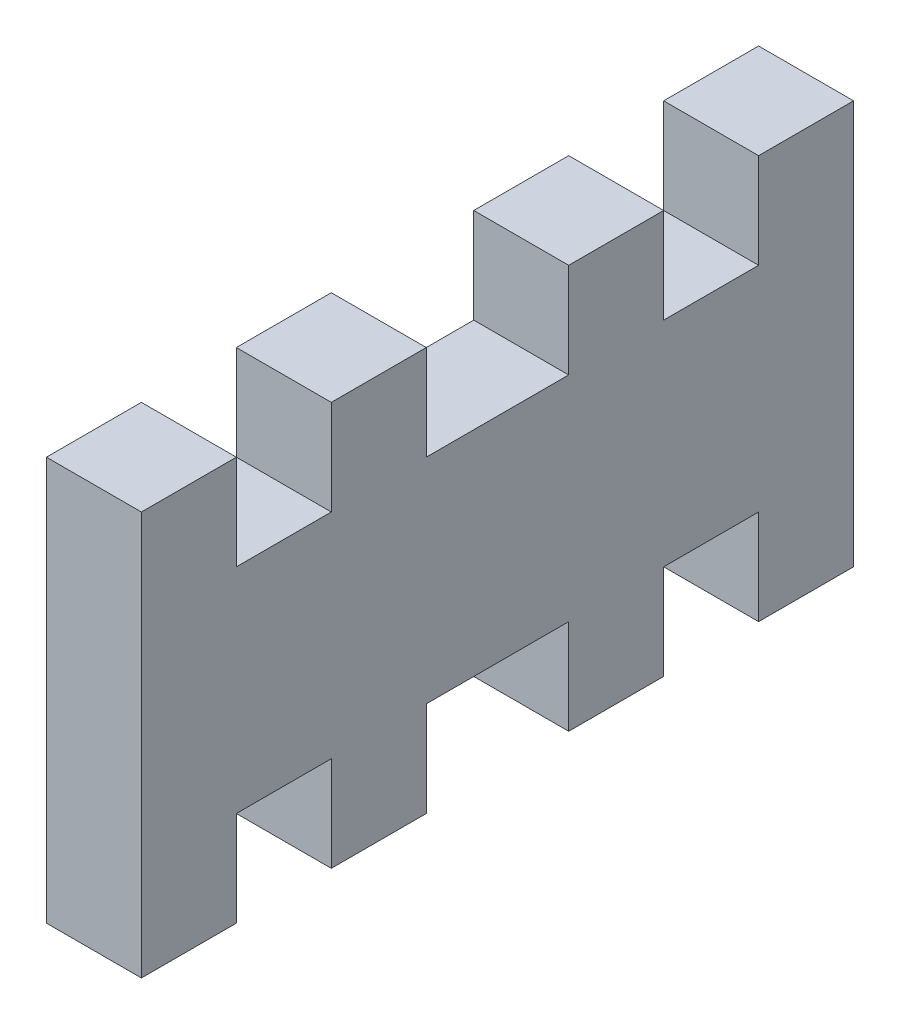
ISO-10303-21;
HEADER;
FILE_DESCRIPTION(('STEP AP214'),'2;1');
FILE_NAME('part.step','',(''),(''),'','','');
FILE_SCHEMA(('AUTOMOTIVE_DESIGN { 1 0 10303 214 1 1 1 1 }'));
ENDSEC;
DATA;
#1=APPLICATION_CONTEXT('core data for automotive mechanical design processes');
#2=APPLICATION_PROTOCOL_DEFINITION('international standard','automotive_design',2000,#1);
#3=PRODUCT_CONTEXT('',#1,'mechanical');
#4=PRODUCT('Part','Part','',(#3));
#5=PRODUCT_RELATED_PRODUCT_CATEGORY('part','',(#4));
#6=PRODUCT_DEFINITION_FORMATION('','',#4);
#7=PRODUCT_DEFINITION_CONTEXT('part definition',#1,'design');
#8=PRODUCT_DEFINITION('design','',#6,#7);
#9=PRODUCT_DEFINITION_SHAPE('','',#8);
#10=(LENGTH_UNIT() NAMED_UNIT(*) SI_UNIT(.MILLI.,.METRE.));
#11=(NAMED_UNIT(*) PLANE_ANGLE_UNIT() SI_UNIT($,.RADIAN.));
#12=(NAMED_UNIT(*) SI_UNIT($,.STERADIAN.) SOLID_ANGLE_UNIT());
#13=UNCERTAINTY_MEASURE_WITH_UNIT(LENGTH_MEASURE(1.E-05),#10,'distance_accuracy_value','');
#14=(GEOMETRIC_REPRESENTATION_CONTEXT(3) GLOBAL_UNCERTAINTY_ASSIGNED_CONTEXT((#13)) GLOBAL_UNIT_ASSIGNED_CONTEXT((#10,
#11,#12)) REPRESENTATION_CONTEXT('',''));
#15=CARTESIAN_POINT('',(0.,0.,0.));
#16=DIRECTION('',(0.,0.,1.));
#17=DIRECTION('',(1.,0.,0.));
#18=AXIS2_PLACEMENT_3D('',#15,#16,#17);
#19=CARTESIAN_POINT('',(5.08,4.2952358490566,13.6584905660377));
#20=DIRECTION('',(0.,1.,0.));
#21=DIRECTION('',(0.,0.,1.));
#22=AXIS2_PLACEMENT_3D('',#19,#20,#21);
#23=PLANE('',#22);
#24=DIRECTION('',(0.,0.,-1.));
#25=VECTOR('',#24,1.);
#26=CARTESIAN_POINT('',(5.08,4.2952358490566,13.6584905660377));
#27=LINE('',#26,#25);
#28=CARTESIAN_POINT('',(5.08,4.2952358490566,-14.2815094339623));
#29=VERTEX_POINT('',#28);
#30=CARTESIAN_POINT('',(5.08,4.2952358490566,-19.3615094339622));
#31=VERTEX_POINT('',#30);
#32=EDGE_CURVE('E37',#29,#31,#27,.T.);
#33=ORIENTED_EDGE('',*,*,#32,.F.);
#34=DIRECTION('',(1.,0.,0.));
#35=VECTOR('',#34,1.);
#36=CARTESIAN_POINT('',(0.,4.29523584905661,-14.2815094339623));
#37=LINE('',#36,#35);
#38=CARTESIAN_POINT('',(0.,4.29523584905661,-14.2815094339623));
#39=VERTEX_POINT('',#38);
#40=EDGE_CURVE('E252',#39,#29,#37,.T.);
#41=ORIENTED_EDGE('',*,*,#40,.F.);
#42=DIRECTION('',(0.,0.,-1.));
#43=VECTOR('',#42,1.);
#44=CARTESIAN_POINT('',(0.,4.2952358490566,13.6584905660377));
#45=LINE('',#44,#43);
#46=CARTESIAN_POINT('',(0.,4.2952358490566,-19.3615094339622));
#47=VERTEX_POINT('',#46);
#48=EDGE_CURVE('E351',#39,#47,#45,.T.);
#49=ORIENTED_EDGE('',*,*,#48,.T.);
#50=DIRECTION('',(1.,0.,0.));
#51=VECTOR('',#50,1.);
#52=CARTESIAN_POINT('',(0.,4.29523584905661,-19.3615094339622));
#53=LINE('',#52,#51);
#54=EDGE_CURVE('E264',#47,#31,#53,.T.);
#55=ORIENTED_EDGE('',*,*,#54,.T.);
#56=EDGE_LOOP('',(#33,#41,#49,#55));
#57=FACE_BOUND('',#56,.T.);
#58=ADVANCED_FACE('F33',(#57),#23,.F.);
#59=CARTESIAN_POINT('',(0.,4.29523584905661,-1.58150943396227));
#60=VERTEX_POINT('',#59);
#61=CARTESIAN_POINT('',(0.,4.2952358490566,-9.20150943396225));
#62=VERTEX_POINT('',#61);
#63=EDGE_CURVE('E338',#60,#62,#45,.T.);
#64=ORIENTED_EDGE('',*,*,#63,.T.);
#65=DIRECTION('',(1.,0.,0.));
#66=VECTOR('',#65,1.);
#67=CARTESIAN_POINT('',(0.,4.29523584905661,-9.20150943396226));
#68=LINE('',#67,#66);
#69=CARTESIAN_POINT('',(5.08,4.2952358490566,-9.20150943396225));
#70=VERTEX_POINT('',#69);
#71=EDGE_CURVE('E58',#62,#70,#68,.T.);
#72=ORIENTED_EDGE('',*,*,#71,.T.);
#73=CARTESIAN_POINT('',(5.08,4.29523584905661,-1.58150943396227));
#74=VERTEX_POINT('',#73);
#75=EDGE_CURVE('E540',#74,#70,#27,.T.);
#76=ORIENTED_EDGE('',*,*,#75,.F.);
#77=DIRECTION('',(1.,0.,0.));
#78=VECTOR('',#77,1.);
#79=CARTESIAN_POINT('',(0.,4.29523584905661,-1.58150943396227));
#80=LINE('',#79,#78);
#81=EDGE_CURVE('E299',#60,#74,#80,.T.);
#82=ORIENTED_EDGE('',*,*,#81,.F.);
#83=EDGE_LOOP('',(#64,#72,#76,#82));
#84=FACE_BOUND('',#83,.T.);
#85=ADVANCED_FACE('F520',(#84),#23,.F.);
#86=CARTESIAN_POINT('',(5.08,15.7252358490566,13.6584905660377));
#87=DIRECTION('',(0.,-1.,0.));
#88=DIRECTION('',(0.,0.,-1.));
#89=AXIS2_PLACEMENT_3D('',#86,#87,#88);
#90=PLANE('',#89);
#91=DIRECTION('',(0.,0.,1.));
#92=VECTOR('',#91,1.);
#93=CARTESIAN_POINT('',(5.08,15.7252358490566,13.6584905660377));
#94=LINE('',#93,#92);
#95=CARTESIAN_POINT('',(5.08,15.7252358490566,3.49849056603773));
#96=VERTEX_POINT('',#95);
#97=CARTESIAN_POINT('',(5.08,15.7252358490566,8.57849056603773));
#98=VERTEX_POINT('',#97);
#99=EDGE_CURVE('E408',#96,#98,#94,.T.);
#100=ORIENTED_EDGE('',*,*,#99,.F.);
#101=DIRECTION('',(1.,0.,0.));
#102=VECTOR('',#101,1.);
#103=CARTESIAN_POINT('',(0.,15.7252358490566,3.49849056603773));
#104=LINE('',#103,#102);
#105=CARTESIAN_POINT('',(0.,15.7252358490566,3.49849056603773));
#106=VERTEX_POINT('',#105);
#107=EDGE_CURVE('E465',#106,#96,#104,.T.);
#108=ORIENTED_EDGE('',*,*,#107,.F.);
#109=DIRECTION('',(0.,0.,1.));
#110=VECTOR('',#109,1.);
#111=CARTESIAN_POINT('',(0.,15.7252358490566,13.6584905660377));
#112=LINE('',#111,#110);
#113=CARTESIAN_POINT('',(0.,15.7252358490566,8.57849056603773));
#114=VERTEX_POINT('',#113);
#115=EDGE_CURVE('E407',#106,#114,#112,.T.);
#116=ORIENTED_EDGE('',*,*,#115,.T.);
#117=DIRECTION('',(1.,0.,0.));
#118=VECTOR('',#117,1.);
#119=CARTESIAN_POINT('',(0.,15.7252358490566,8.57849056603773));
#120=LINE('',#119,#118);
#121=EDGE_CURVE('E450',#114,#98,#120,.T.);
#122=ORIENTED_EDGE('',*,*,#121,.T.);
#123=EDGE_LOOP('',(#100,#108,#116,#122));
#124=FACE_BOUND('',#123,.T.);
#125=ADVANCED_FACE('F525',(#124),#90,.F.);
#126=CARTESIAN_POINT('',(0.,15.7252358490566,-9.20150943396227));
#127=VERTEX_POINT('',#126);
#128=CARTESIAN_POINT('',(0.,15.7252358490566,-1.58150943396227));
#129=VERTEX_POINT('',#128);
#130=EDGE_CURVE('E400',#127,#129,#112,.T.);
#131=ORIENTED_EDGE('',*,*,#130,.T.);
#132=DIRECTION('',(1.,0.,0.));
#133=VECTOR('',#132,1.);
#134=CARTESIAN_POINT('',(0.,15.7252358490566,-1.58150943396227));
#135=LINE('',#134,#133);
#136=CARTESIAN_POINT('',(5.08,15.7252358490566,-1.58150943396227));
#137=VERTEX_POINT('',#136);
#138=EDGE_CURVE('E470',#129,#137,#135,.T.);
#139=ORIENTED_EDGE('',*,*,#138,.T.);
#140=CARTESIAN_POINT('',(5.08,15.7252358490566,-9.20150943396227));
#141=VERTEX_POINT('',#140);
#142=EDGE_CURVE('E43',#141,#137,#94,.T.);
#143=ORIENTED_EDGE('',*,*,#142,.F.);
#144=DIRECTION('',(1.,0.,0.));
#145=VECTOR('',#144,1.);
#146=CARTESIAN_POINT('',(0.,15.7252358490566,-9.20150943396227));
#147=LINE('',#146,#145);
#148=EDGE_CURVE('E377',#127,#141,#147,.T.);
#149=ORIENTED_EDGE('',*,*,#148,.F.);
#150=EDGE_LOOP('',(#131,#139,#143,#149));
#151=FACE_BOUND('',#150,.T.);
#152=ADVANCED_FACE('F506',(#151),#90,.F.);
#153=CARTESIAN_POINT('',(5.08,15.7252358490566,13.6584905660377));
#154=DIRECTION('',(0.,0.,-1.));
#155=DIRECTION('',(0.,1.,0.));
#156=AXIS2_PLACEMENT_3D('',#153,#154,#155);
#157=PLANE('',#156);
#158=DIRECTION('',(0.,-1.,0.));
#159=VECTOR('',#158,1.);
#160=CARTESIAN_POINT('',(0.,15.7252358490566,13.6584905660377));
#161=LINE('',#160,#159);
#162=CARTESIAN_POINT('',(0.,20.8052358490566,13.6584905660377));
#163=VERTEX_POINT('',#162);
#164=CARTESIAN_POINT('',(0.,-0.784764150943393,13.6584905660377));
#165=VERTEX_POINT('',#164);
#166=EDGE_CURVE('E343',#163,#165,#161,.T.);
#167=ORIENTED_EDGE('',*,*,#166,.T.);
#168=DIRECTION('',(1.,0.,0.));
#169=VECTOR('',#168,1.);
#170=CARTESIAN_POINT('',(0.,-0.784764150943393,13.6584905660377));
#171=LINE('',#170,#169);
#172=CARTESIAN_POINT('',(5.08,-0.784764150943393,13.6584905660377));
#173=VERTEX_POINT('',#172);
#174=EDGE_CURVE('E291',#165,#173,#171,.T.);
#175=ORIENTED_EDGE('',*,*,#174,.T.);
#176=DIRECTION('',(0.,-1.,0.));
#177=VECTOR('',#176,1.);
#178=CARTESIAN_POINT('',(5.08,15.7252358490566,13.6584905660377));
#179=LINE('',#178,#177);
#180=CARTESIAN_POINT('',(5.08,20.8052358490566,13.6584905660377));
#181=VERTEX_POINT('',#180);
#182=EDGE_CURVE('E399',#181,#173,#179,.T.);
#183=ORIENTED_EDGE('',*,*,#182,.F.);
#184=DIRECTION('',(1.,0.,0.));
#185=VECTOR('',#184,1.);
#186=CARTESIAN_POINT('',(0.,20.8052358490566,13.6584905660377));
#187=LINE('',#186,#185);
#188=EDGE_CURVE('E445',#163,#181,#187,.T.);
#189=ORIENTED_EDGE('',*,*,#188,.F.);
#190=EDGE_LOOP('',(#167,#175,#183,#189));
#191=FACE_BOUND('',#190,.T.);
#192=ADVANCED_FACE('F35',(#191),#157,.F.);
#193=CARTESIAN_POINT('',(5.08,4.2952358490566,8.57849056603773));
#194=VERTEX_POINT('',#193);
#195=CARTESIAN_POINT('',(5.08,4.2952358490566,3.49849056603774));
#196=VERTEX_POINT('',#195);
#197=EDGE_CURVE('E339',#194,#196,#27,.T.);
#198=ORIENTED_EDGE('',*,*,#197,.F.);
#199=DIRECTION('',(1.,0.,0.));
#200=VECTOR('',#199,1.);
#201=CARTESIAN_POINT('',(0.,4.29523584905661,8.57849056603773));
#202=LINE('',#201,#200);
#203=CARTESIAN_POINT('',(0.,4.29523584905661,8.57849056603773));
#204=VERTEX_POINT('',#203);
#205=EDGE_CURVE('E283',#204,#194,#202,.T.);
#206=ORIENTED_EDGE('',*,*,#205,.F.);
#207=CARTESIAN_POINT('',(0.,4.29523584905661,3.49849056603773));
#208=VERTEX_POINT('',#207);
#209=EDGE_CURVE('E334',#204,#208,#45,.T.);
#210=ORIENTED_EDGE('',*,*,#209,.T.);
#211=DIRECTION('',(1.,0.,0.));
#212=VECTOR('',#211,1.);
#213=CARTESIAN_POINT('',(0.,4.29523584905661,3.49849056603773));
#214=LINE('',#213,#212);
#215=EDGE_CURVE('E311',#208,#196,#214,.T.);
#216=ORIENTED_EDGE('',*,*,#215,.T.);
#217=EDGE_LOOP('',(#198,#206,#210,#216));
#218=FACE_BOUND('',#217,.T.);
#219=ADVANCED_FACE('F521',(#218),#23,.F.);
#220=CARTESIAN_POINT('',(5.08,15.7252358490566,-24.4415094339623));
#221=DIRECTION('',(0.,0.,1.));
#222=DIRECTION('',(1.,0.,0.));
#223=AXIS2_PLACEMENT_3D('',#220,#221,#222);
#224=PLANE('',#223);
#225=DIRECTION('',(0.,1.,0.));
#226=VECTOR('',#225,1.);
#227=CARTESIAN_POINT('',(0.,15.7252358490566,-24.4415094339623));
#228=LINE('',#227,#226);
#229=CARTESIAN_POINT('',(0.,-0.784764150943393,-24.4415094339622));
#230=VERTEX_POINT('',#229);
#231=CARTESIAN_POINT('',(0.,20.8052358490566,-24.4415094339623));
#232=VERTEX_POINT('',#231);
#233=EDGE_CURVE('E337',#230,#232,#228,.T.);
#234=ORIENTED_EDGE('',*,*,#233,.T.);
#235=DIRECTION('',(1.,0.,0.));
#236=VECTOR('',#235,1.);
#237=CARTESIAN_POINT('',(0.,20.8052358490566,-24.4415094339623));
#238=LINE('',#237,#236);
#239=CARTESIAN_POINT('',(5.08,20.8052358490566,-24.4415094339623));
#240=VERTEX_POINT('',#239);
#241=EDGE_CURVE('E433',#232,#240,#238,.T.);
#242=ORIENTED_EDGE('',*,*,#241,.T.);
#243=DIRECTION('',(0.,1.,0.));
#244=VECTOR('',#243,1.);
#245=CARTESIAN_POINT('',(5.08,15.7252358490566,-24.4415094339623));
#246=LINE('',#245,#244);
#247=CARTESIAN_POINT('',(5.08,-0.784764150943393,-24.4415094339622));
#248=VERTEX_POINT('',#247);
#249=EDGE_CURVE('E409',#248,#240,#246,.T.);
#250=ORIENTED_EDGE('',*,*,#249,.F.);
#251=DIRECTION('',(1.,0.,0.));
#252=VECTOR('',#251,1.);
#253=CARTESIAN_POINT('',(0.,-0.784764150943393,-24.4415094339622));
#254=LINE('',#253,#252);
#255=EDGE_CURVE('E269',#230,#248,#254,.T.);
#256=ORIENTED_EDGE('',*,*,#255,.F.);
#257=EDGE_LOOP('',(#234,#242,#250,#256));
#258=FACE_BOUND('',#257,.T.);
#259=ADVANCED_FACE('F528',(#258),#224,.F.);
#260=CARTESIAN_POINT('',(5.08,15.7252358490566,-19.3615094339623));
#261=VERTEX_POINT('',#260);
#262=CARTESIAN_POINT('',(5.08,15.7252358490566,-14.2815094339623));
#263=VERTEX_POINT('',#262);
#264=EDGE_CURVE('E11',#261,#263,#94,.T.);
#265=ORIENTED_EDGE('',*,*,#264,.F.);
#266=DIRECTION('',(1.,0.,0.));
#267=VECTOR('',#266,1.);
#268=CARTESIAN_POINT('',(0.,15.7252358490566,-19.3615094339623));
#269=LINE('',#268,#267);
#270=CARTESIAN_POINT('',(0.,15.7252358490566,-19.3615094339623));
#271=VERTEX_POINT('',#270);
#272=EDGE_CURVE('E430',#271,#261,#269,.T.);
#273=ORIENTED_EDGE('',*,*,#272,.F.);
#274=CARTESIAN_POINT('',(0.,15.7252358490566,-14.2815094339623));
#275=VERTEX_POINT('',#274);
#276=EDGE_CURVE('E398',#271,#275,#112,.T.);
#277=ORIENTED_EDGE('',*,*,#276,.T.);
#278=DIRECTION('',(1.,0.,0.));
#279=VECTOR('',#278,1.);
#280=CARTESIAN_POINT('',(0.,15.7252358490566,-14.2815094339623));
#281=LINE('',#280,#279);
#282=EDGE_CURVE('E363',#275,#263,#281,.T.);
#283=ORIENTED_EDGE('',*,*,#282,.T.);
#284=EDGE_LOOP('',(#265,#273,#277,#283));
#285=FACE_BOUND('',#284,.T.);
#286=ADVANCED_FACE('F534',(#285),#90,.F.);
#287=CARTESIAN_POINT('',(5.08,0.,0.));
#288=DIRECTION('',(1.,0.,0.));
#289=DIRECTION('',(0.,0.,-1.));
#290=AXIS2_PLACEMENT_3D('',#287,#288,#289);
#291=PLANE('',#290);
#292=ORIENTED_EDGE('',*,*,#182,.T.);
#293=DIRECTION('',(0.,0.,-1.));
#294=VECTOR('',#293,1.);
#295=CARTESIAN_POINT('',(5.08,-0.784764150943393,8.57849056603773));
#296=LINE('',#295,#294);
#297=CARTESIAN_POINT('',(5.08,-0.784764150943393,8.57849056603773));
#298=VERTEX_POINT('',#297);
#299=EDGE_CURVE('E280',#173,#298,#296,.T.);
#300=ORIENTED_EDGE('',*,*,#299,.T.);
#301=DIRECTION('',(0.,1.,0.));
#302=VECTOR('',#301,1.);
#303=CARTESIAN_POINT('',(5.08,4.29523584905661,8.57849056603773));
#304=LINE('',#303,#302);
#305=EDGE_CURVE('E272',#298,#194,#304,.T.);
#306=ORIENTED_EDGE('',*,*,#305,.T.);
#307=ORIENTED_EDGE('',*,*,#197,.T.);
#308=DIRECTION('',(0.,-1.,0.));
#309=VECTOR('',#308,1.);
#310=CARTESIAN_POINT('',(5.08,4.29523584905661,3.49849056603773));
#311=LINE('',#310,#309);
#312=CARTESIAN_POINT('',(5.08,-0.784764150943393,3.49849056603773));
#313=VERTEX_POINT('',#312);
#314=EDGE_CURVE('E305',#196,#313,#311,.T.);
#315=ORIENTED_EDGE('',*,*,#314,.T.);
#316=DIRECTION('',(0.,0.,-1.));
#317=VECTOR('',#316,1.);
#318=CARTESIAN_POINT('',(5.08,-0.784764150943393,-1.58150943396227));
#319=LINE('',#318,#317);
#320=CARTESIAN_POINT('',(5.08,-0.784764150943393,-1.58150943396227));
#321=VERTEX_POINT('',#320);
#322=EDGE_CURVE('E301',#313,#321,#319,.T.);
#323=ORIENTED_EDGE('',*,*,#322,.T.);
#324=DIRECTION('',(0.,1.,0.));
#325=VECTOR('',#324,1.);
#326=CARTESIAN_POINT('',(5.08,4.29523584905661,-1.58150943396227));
#327=LINE('',#326,#325);
#328=EDGE_CURVE('E290',#321,#74,#327,.T.);
#329=ORIENTED_EDGE('',*,*,#328,.T.);
#330=ORIENTED_EDGE('',*,*,#75,.T.);
#331=DIRECTION('',(0.,-1.,0.));
#332=VECTOR('',#331,1.);
#333=CARTESIAN_POINT('',(5.08,4.29523584905661,-9.20150943396226));
#334=LINE('',#333,#332);
#335=CARTESIAN_POINT('',(5.08,-0.784764150943393,-9.20150943396226));
#336=VERTEX_POINT('',#335);
#337=EDGE_CURVE('E249',#70,#336,#334,.T.);
#338=ORIENTED_EDGE('',*,*,#337,.T.);
#339=DIRECTION('',(0.,0.,-1.));
#340=VECTOR('',#339,1.);
#341=CARTESIAN_POINT('',(5.08,-0.784764150943393,-9.20150943396226));
#342=LINE('',#341,#340);
#343=CARTESIAN_POINT('',(5.08,-0.784764150943393,-14.2815094339623));
#344=VERTEX_POINT('',#343);
#345=EDGE_CURVE('E227',#336,#344,#342,.T.);
#346=ORIENTED_EDGE('',*,*,#345,.T.);
#347=DIRECTION('',(0.,1.,0.));
#348=VECTOR('',#347,1.);
#349=CARTESIAN_POINT('',(5.08,4.29523584905661,-14.2815094339623));
#350=LINE('',#349,#348);
#351=EDGE_CURVE('E243',#344,#29,#350,.T.);
#352=ORIENTED_EDGE('',*,*,#351,.T.);
#353=ORIENTED_EDGE('',*,*,#32,.T.);
#354=DIRECTION('',(0.,-1.,0.));
#355=VECTOR('',#354,1.);
#356=CARTESIAN_POINT('',(5.08,4.29523584905661,-19.3615094339622));
#357=LINE('',#356,#355);
#358=CARTESIAN_POINT('',(5.08,-0.784764150943393,-19.3615094339622));
#359=VERTEX_POINT('',#358);
#360=EDGE_CURVE('E254',#31,#359,#357,.T.);
#361=ORIENTED_EDGE('',*,*,#360,.T.);
#362=DIRECTION('',(0.,0.,-1.));
#363=VECTOR('',#362,1.);
#364=CARTESIAN_POINT('',(5.08,-0.784764150943393,-19.3615094339622));
#365=LINE('',#364,#363);
#366=EDGE_CURVE('E261',#359,#248,#365,.T.);
#367=ORIENTED_EDGE('',*,*,#366,.T.);
#368=ORIENTED_EDGE('',*,*,#249,.T.);
#369=DIRECTION('',(0.,0.,1.));
#370=VECTOR('',#369,1.);
#371=CARTESIAN_POINT('',(5.08,20.8052358490566,-19.3615094339623));
#372=LINE('',#371,#370);
#373=CARTESIAN_POINT('',(5.08,20.8052358490566,-19.3615094339623));
#374=VERTEX_POINT('',#373);
#375=EDGE_CURVE('E438',#240,#374,#372,.T.);
#376=ORIENTED_EDGE('',*,*,#375,.T.);
#377=DIRECTION('',(0.,-1.,0.));
#378=VECTOR('',#377,1.);
#379=CARTESIAN_POINT('',(5.08,15.7252358490566,-19.3615094339623));
#380=LINE('',#379,#378);
#381=EDGE_CURVE('E442',#374,#261,#380,.T.);
#382=ORIENTED_EDGE('',*,*,#381,.T.);
#383=ORIENTED_EDGE('',*,*,#264,.T.);
#384=DIRECTION('',(0.,1.,0.));
#385=VECTOR('',#384,1.);
#386=CARTESIAN_POINT('',(5.08,15.7252358490566,-14.2815094339623));
#387=LINE('',#386,#385);
#388=CARTESIAN_POINT('',(5.08,20.8052358490566,-14.2815094339623));
#389=VERTEX_POINT('',#388);
#390=EDGE_CURVE('E394',#263,#389,#387,.T.);
#391=ORIENTED_EDGE('',*,*,#390,.T.);
#392=DIRECTION('',(0.,0.,1.));
#393=VECTOR('',#392,1.);
#394=CARTESIAN_POINT('',(5.08,20.8052358490566,-9.20150943396227));
#395=LINE('',#394,#393);
#396=CARTESIAN_POINT('',(5.08,20.8052358490566,-9.20150943396227));
#397=VERTEX_POINT('',#396);
#398=EDGE_CURVE('E366',#389,#397,#395,.T.);
#399=ORIENTED_EDGE('',*,*,#398,.T.);
#400=DIRECTION('',(0.,-1.,0.));
#401=VECTOR('',#400,1.);
#402=CARTESIAN_POINT('',(5.08,15.7252358490566,-9.20150943396227));
#403=LINE('',#402,#401);
#404=EDGE_CURVE('E391',#397,#141,#403,.T.);
#405=ORIENTED_EDGE('',*,*,#404,.T.);
#406=ORIENTED_EDGE('',*,*,#142,.T.);
#407=DIRECTION('',(0.,1.,0.));
#408=VECTOR('',#407,1.);
#409=CARTESIAN_POINT('',(5.08,15.7252358490566,-1.58150943396227));
#410=LINE('',#409,#408);
#411=CARTESIAN_POINT('',(5.08,20.8052358490566,-1.58150943396227));
#412=VERTEX_POINT('',#411);
#413=EDGE_CURVE('E308',#137,#412,#410,.T.);
#414=ORIENTED_EDGE('',*,*,#413,.T.);
#415=DIRECTION('',(0.,0.,1.));
#416=VECTOR('',#415,1.);
#417=CARTESIAN_POINT('',(5.08,20.8052358490566,-1.58150943396227));
#418=LINE('',#417,#416);
#419=CARTESIAN_POINT('',(5.08,20.8052358490566,3.49849056603773));
#420=VERTEX_POINT('',#419);
#421=EDGE_CURVE('E483',#412,#420,#418,.T.);
#422=ORIENTED_EDGE('',*,*,#421,.T.);
#423=DIRECTION('',(0.,-1.,0.));
#424=VECTOR('',#423,1.);
#425=CARTESIAN_POINT('',(5.08,15.7252358490566,3.49849056603773));
#426=LINE('',#425,#424);
#427=EDGE_CURVE('E479',#420,#96,#426,.T.);
#428=ORIENTED_EDGE('',*,*,#427,.T.);
#429=ORIENTED_EDGE('',*,*,#99,.T.);
#430=DIRECTION('',(0.,1.,0.));
#431=VECTOR('',#430,1.);
#432=CARTESIAN_POINT('',(5.08,15.7252358490566,8.57849056603773));
#433=LINE('',#432,#431);
#434=CARTESIAN_POINT('',(5.08,20.8052358490566,8.57849056603773));
#435=VERTEX_POINT('',#434);
#436=EDGE_CURVE('E462',#98,#435,#433,.T.);
#437=ORIENTED_EDGE('',*,*,#436,.T.);
#438=DIRECTION('',(0.,0.,1.));
#439=VECTOR('',#438,1.);
#440=CARTESIAN_POINT('',(5.08,20.8052358490566,8.57849056603773));
#441=LINE('',#440,#439);
#442=EDGE_CURVE('E458',#435,#181,#441,.T.);
#443=ORIENTED_EDGE('',*,*,#442,.T.);
#444=EDGE_LOOP('',(#292,#300,#306,#307,#315,#323,#329,#330,#338,#346,#352,#353,#361,#367,#368,
#376,#382,#383,#391,#399,#405,#406,#414,#422,#428,#429,#437,#443));
#445=FACE_BOUND('',#444,.T.);
#446=ADVANCED_FACE('F419',(#445),#291,.T.);
#447=CARTESIAN_POINT('',(0.,0.,0.));
#448=DIRECTION('',(1.,0.,0.));
#449=DIRECTION('',(0.,0.,-1.));
#450=AXIS2_PLACEMENT_3D('',#447,#448,#449);
#451=PLANE('',#450);
#452=ORIENTED_EDGE('',*,*,#166,.F.);
#453=DIRECTION('',(0.,0.,1.));
#454=VECTOR('',#453,1.);
#455=CARTESIAN_POINT('',(0.,20.8052358490566,8.57849056603773));
#456=LINE('',#455,#454);
#457=CARTESIAN_POINT('',(0.,20.8052358490566,8.57849056603773));
#458=VERTEX_POINT('',#457);
#459=EDGE_CURVE('E454',#458,#163,#456,.T.);
#460=ORIENTED_EDGE('',*,*,#459,.F.);
#461=DIRECTION('',(0.,1.,0.));
#462=VECTOR('',#461,1.);
#463=CARTESIAN_POINT('',(0.,15.7252358490566,8.57849056603773));
#464=LINE('',#463,#462);
#465=EDGE_CURVE('E461',#114,#458,#464,.T.);
#466=ORIENTED_EDGE('',*,*,#465,.F.);
#467=ORIENTED_EDGE('',*,*,#115,.F.);
#468=DIRECTION('',(0.,-1.,0.));
#469=VECTOR('',#468,1.);
#470=CARTESIAN_POINT('',(0.,15.7252358490566,3.49849056603773));
#471=LINE('',#470,#469);
#472=CARTESIAN_POINT('',(0.,20.8052358490566,3.49849056603773));
#473=VERTEX_POINT('',#472);
#474=EDGE_CURVE('E473',#473,#106,#471,.T.);
#475=ORIENTED_EDGE('',*,*,#474,.F.);
#476=DIRECTION('',(0.,0.,1.));
#477=VECTOR('',#476,1.);
#478=CARTESIAN_POINT('',(0.,20.8052358490566,-1.58150943396227));
#479=LINE('',#478,#477);
#480=CARTESIAN_POINT('',(0.,20.8052358490566,-1.58150943396227));
#481=VERTEX_POINT('',#480);
#482=EDGE_CURVE('E490',#481,#473,#479,.T.);
#483=ORIENTED_EDGE('',*,*,#482,.F.);
#484=DIRECTION('',(0.,1.,0.));
#485=VECTOR('',#484,1.);
#486=CARTESIAN_POINT('',(0.,15.7252358490566,-1.58150943396227));
#487=LINE('',#486,#485);
#488=EDGE_CURVE('E482',#129,#481,#487,.T.);
#489=ORIENTED_EDGE('',*,*,#488,.F.);
#490=ORIENTED_EDGE('',*,*,#130,.F.);
#491=DIRECTION('',(0.,-1.,0.));
#492=VECTOR('',#491,1.);
#493=CARTESIAN_POINT('',(0.,15.7252358490566,-9.20150943396227));
#494=LINE('',#493,#492);
#495=CARTESIAN_POINT('',(0.,20.8052358490566,-9.20150943396227));
#496=VERTEX_POINT('',#495);
#497=EDGE_CURVE('E384',#496,#127,#494,.T.);
#498=ORIENTED_EDGE('',*,*,#497,.F.);
#499=DIRECTION('',(0.,0.,1.));
#500=VECTOR('',#499,1.);
#501=CARTESIAN_POINT('',(0.,20.8052358490566,-9.20150943396227));
#502=LINE('',#501,#500);
#503=CARTESIAN_POINT('',(0.,20.8052358490566,-14.2815094339623));
#504=VERTEX_POINT('',#503);
#505=EDGE_CURVE('E383',#504,#496,#502,.T.);
#506=ORIENTED_EDGE('',*,*,#505,.F.);
#507=DIRECTION('',(0.,1.,0.));
#508=VECTOR('',#507,1.);
#509=CARTESIAN_POINT('',(0.,15.7252358490566,-14.2815094339623));
#510=LINE('',#509,#508);
#511=EDGE_CURVE('E380',#275,#504,#510,.T.);
#512=ORIENTED_EDGE('',*,*,#511,.F.);
#513=ORIENTED_EDGE('',*,*,#276,.F.);
#514=DIRECTION('',(0.,-1.,0.));
#515=VECTOR('',#514,1.);
#516=CARTESIAN_POINT('',(0.,15.7252358490566,-19.3615094339623));
#517=LINE('',#516,#515);
#518=CARTESIAN_POINT('',(0.,20.8052358490566,-19.3615094339623));
#519=VERTEX_POINT('',#518);
#520=EDGE_CURVE('E441',#519,#271,#517,.T.);
#521=ORIENTED_EDGE('',*,*,#520,.F.);
#522=DIRECTION('',(0.,0.,1.));
#523=VECTOR('',#522,1.);
#524=CARTESIAN_POINT('',(0.,20.8052358490566,-19.3615094339623));
#525=LINE('',#524,#523);
#526=EDGE_CURVE('E434',#232,#519,#525,.T.);
#527=ORIENTED_EDGE('',*,*,#526,.F.);
#528=ORIENTED_EDGE('',*,*,#233,.F.);
#529=DIRECTION('',(0.,0.,-1.));
#530=VECTOR('',#529,1.);
#531=CARTESIAN_POINT('',(0.,-0.784764150943393,-19.3615094339622));
#532=LINE('',#531,#530);
#533=CARTESIAN_POINT('',(0.,-0.784764150943393,-19.3615094339622));
#534=VERTEX_POINT('',#533);
#535=EDGE_CURVE('E260',#534,#230,#532,.T.);
#536=ORIENTED_EDGE('',*,*,#535,.F.);
#537=DIRECTION('',(0.,-1.,0.));
#538=VECTOR('',#537,1.);
#539=CARTESIAN_POINT('',(0.,4.29523584905661,-19.3615094339622));
#540=LINE('',#539,#538);
#541=EDGE_CURVE('E257',#47,#534,#540,.T.);
#542=ORIENTED_EDGE('',*,*,#541,.F.);
#543=ORIENTED_EDGE('',*,*,#48,.F.);
#544=DIRECTION('',(0.,1.,0.));
#545=VECTOR('',#544,1.);
#546=CARTESIAN_POINT('',(0.,4.29523584905661,-14.2815094339623));
#547=LINE('',#546,#545);
#548=CARTESIAN_POINT('',(0.,-0.784764150943393,-14.2815094339623));
#549=VERTEX_POINT('',#548);
#550=EDGE_CURVE('E240',#549,#39,#547,.T.);
#551=ORIENTED_EDGE('',*,*,#550,.F.);
#552=DIRECTION('',(0.,0.,-1.));
#553=VECTOR('',#552,1.);
#554=CARTESIAN_POINT('',(0.,-0.784764150943393,-9.20150943396226));
#555=LINE('',#554,#553);
#556=CARTESIAN_POINT('',(0.,-0.784764150943393,-9.20150943396226));
#557=VERTEX_POINT('',#556);
#558=EDGE_CURVE('E224',#557,#549,#555,.T.);
#559=ORIENTED_EDGE('',*,*,#558,.F.);
#560=DIRECTION('',(0.,-1.,0.));
#561=VECTOR('',#560,1.);
#562=CARTESIAN_POINT('',(0.,4.29523584905661,-9.20150943396226));
#563=LINE('',#562,#561);
#564=EDGE_CURVE('E238',#62,#557,#563,.T.);
#565=ORIENTED_EDGE('',*,*,#564,.F.);
#566=ORIENTED_EDGE('',*,*,#63,.F.);
#567=DIRECTION('',(0.,1.,0.));
#568=VECTOR('',#567,1.);
#569=CARTESIAN_POINT('',(0.,4.29523584905661,-1.58150943396227));
#570=LINE('',#569,#568);
#571=CARTESIAN_POINT('',(0.,-0.784764150943393,-1.58150943396227));
#572=VERTEX_POINT('',#571);
#573=EDGE_CURVE('E304',#572,#60,#570,.T.);
#574=ORIENTED_EDGE('',*,*,#573,.F.);
#575=DIRECTION('',(0.,0.,-1.));
#576=VECTOR('',#575,1.);
#577=CARTESIAN_POINT('',(0.,-0.784764150943393,-1.58150943396227));
#578=LINE('',#577,#576);
#579=CARTESIAN_POINT('',(0.,-0.784764150943393,3.49849056603773));
#580=VERTEX_POINT('',#579);
#581=EDGE_CURVE('E296',#580,#572,#578,.T.);
#582=ORIENTED_EDGE('',*,*,#581,.F.);
#583=DIRECTION('',(0.,-1.,0.));
#584=VECTOR('',#583,1.);
#585=CARTESIAN_POINT('',(0.,4.29523584905661,3.49849056603773));
#586=LINE('',#585,#584);
#587=EDGE_CURVE('E300',#208,#580,#586,.T.);
#588=ORIENTED_EDGE('',*,*,#587,.F.);
#589=ORIENTED_EDGE('',*,*,#209,.F.);
#590=DIRECTION('',(0.,1.,0.));
#591=VECTOR('',#590,1.);
#592=CARTESIAN_POINT('',(0.,4.29523584905661,8.57849056603773));
#593=LINE('',#592,#591);
#594=CARTESIAN_POINT('',(0.,-0.784764150943393,8.57849056603773));
#595=VERTEX_POINT('',#594);
#596=EDGE_CURVE('E276',#595,#204,#593,.T.);
#597=ORIENTED_EDGE('',*,*,#596,.F.);
#598=DIRECTION('',(0.,0.,-1.));
#599=VECTOR('',#598,1.);
#600=CARTESIAN_POINT('',(0.,-0.784764150943393,8.57849056603773));
#601=LINE('',#600,#599);
#602=EDGE_CURVE('E279',#165,#595,#601,.T.);
#603=ORIENTED_EDGE('',*,*,#602,.F.);
#604=EDGE_LOOP('',(#452,#460,#466,#467,#475,#483,#489,#490,#498,#506,#512,#513,#521,#527,#528,
#536,#542,#543,#551,#559,#565,#566,#574,#582,#588,#589,#597,#603));
#605=FACE_BOUND('',#604,.T.);
#606=ADVANCED_FACE('F236',(#605),#451,.F.);
#607=CARTESIAN_POINT('',(0.,15.7252358490566,-9.20150943396227));
#608=DIRECTION('',(0.,0.,1.));
#609=DIRECTION('',(1.,0.,0.));
#610=AXIS2_PLACEMENT_3D('',#607,#608,#609);
#611=PLANE('',#610);
#612=ORIENTED_EDGE('',*,*,#404,.F.);
#613=DIRECTION('',(1.,0.,0.));
#614=VECTOR('',#613,1.);
#615=CARTESIAN_POINT('',(0.,20.8052358490566,-9.20150943396227));
#616=LINE('',#615,#614);
#617=EDGE_CURVE('E353',#496,#397,#616,.T.);
#618=ORIENTED_EDGE('',*,*,#617,.F.);
#619=ORIENTED_EDGE('',*,*,#497,.T.);
#620=ORIENTED_EDGE('',*,*,#148,.T.);
#621=EDGE_LOOP('',(#612,#618,#619,#620));
#622=FACE_BOUND('',#621,.T.);
#623=ADVANCED_FACE('F508',(#622),#611,.T.);
#624=CARTESIAN_POINT('',(0.,20.8052358490566,-9.20150943396227));
#625=DIRECTION('',(0.,1.,0.));
#626=DIRECTION('',(0.,0.,1.));
#627=AXIS2_PLACEMENT_3D('',#624,#625,#626);
#628=PLANE('',#627);
#629=ORIENTED_EDGE('',*,*,#398,.F.);
#630=DIRECTION('',(1.,0.,0.));
#631=VECTOR('',#630,1.);
#632=CARTESIAN_POINT('',(0.,20.8052358490566,-14.2815094339623));
#633=LINE('',#632,#631);
#634=EDGE_CURVE('E357',#504,#389,#633,.T.);
#635=ORIENTED_EDGE('',*,*,#634,.F.);
#636=ORIENTED_EDGE('',*,*,#505,.T.);
#637=ORIENTED_EDGE('',*,*,#617,.T.);
#638=EDGE_LOOP('',(#629,#635,#636,#637));
#639=FACE_BOUND('',#638,.T.);
#640=ADVANCED_FACE('F421',(#639),#628,.T.);
#641=CARTESIAN_POINT('',(0.,15.7252358490566,-14.2815094339623));
#642=DIRECTION('',(0.,0.,-1.));
#643=DIRECTION('',(-1.,0.,0.));
#644=AXIS2_PLACEMENT_3D('',#641,#642,#643);
#645=PLANE('',#644);
#646=ORIENTED_EDGE('',*,*,#390,.F.);
#647=ORIENTED_EDGE('',*,*,#282,.F.);
#648=ORIENTED_EDGE('',*,*,#511,.T.);
#649=ORIENTED_EDGE('',*,*,#634,.T.);
#650=EDGE_LOOP('',(#646,#647,#648,#649));
#651=FACE_BOUND('',#650,.T.);
#652=ADVANCED_FACE('F426',(#651),#645,.T.);
#653=CARTESIAN_POINT('',(0.,15.7252358490566,-19.3615094339623));
#654=DIRECTION('',(0.,0.,1.));
#655=DIRECTION('',(1.,0.,0.));
#656=AXIS2_PLACEMENT_3D('',#653,#654,#655);
#657=PLANE('',#656);
#658=ORIENTED_EDGE('',*,*,#381,.F.);
#659=DIRECTION('',(1.,0.,0.));
#660=VECTOR('',#659,1.);
#661=CARTESIAN_POINT('',(0.,20.8052358490566,-19.3615094339623));
#662=LINE('',#661,#660);
#663=EDGE_CURVE('E395',#519,#374,#662,.T.);
#664=ORIENTED_EDGE('',*,*,#663,.F.);
#665=ORIENTED_EDGE('',*,*,#520,.T.);
#666=ORIENTED_EDGE('',*,*,#272,.T.);
#667=EDGE_LOOP('',(#658,#664,#665,#666));
#668=FACE_BOUND('',#667,.T.);
#669=ADVANCED_FACE('F575',(#668),#657,.T.);
#670=CARTESIAN_POINT('',(0.,20.8052358490566,-19.3615094339623));
#671=DIRECTION('',(0.,1.,0.));
#672=DIRECTION('',(0.,0.,1.));
#673=AXIS2_PLACEMENT_3D('',#670,#671,#672);
#674=PLANE('',#673);
#675=ORIENTED_EDGE('',*,*,#375,.F.);
#676=ORIENTED_EDGE('',*,*,#241,.F.);
#677=ORIENTED_EDGE('',*,*,#526,.T.);
#678=ORIENTED_EDGE('',*,*,#663,.T.);
#679=EDGE_LOOP('',(#675,#676,#677,#678));
#680=FACE_BOUND('',#679,.T.);
#681=ADVANCED_FACE('F571',(#680),#674,.T.);
#682=CARTESIAN_POINT('',(0.,20.8052358490566,8.57849056603773));
#683=DIRECTION('',(0.,1.,0.));
#684=DIRECTION('',(0.,0.,1.));
#685=AXIS2_PLACEMENT_3D('',#682,#683,#684);
#686=PLANE('',#685);
#687=ORIENTED_EDGE('',*,*,#442,.F.);
#688=DIRECTION('',(1.,0.,0.));
#689=VECTOR('',#688,1.);
#690=CARTESIAN_POINT('',(0.,20.8052358490566,8.57849056603773));
#691=LINE('',#690,#689);
#692=EDGE_CURVE('E453',#458,#435,#691,.T.);
#693=ORIENTED_EDGE('',*,*,#692,.F.);
#694=ORIENTED_EDGE('',*,*,#459,.T.);
#695=ORIENTED_EDGE('',*,*,#188,.T.);
#696=EDGE_LOOP('',(#687,#693,#694,#695));
#697=FACE_BOUND('',#696,.T.);
#698=ADVANCED_FACE('F604',(#697),#686,.T.);
#699=CARTESIAN_POINT('',(0.,15.7252358490566,8.57849056603773));
#700=DIRECTION('',(0.,0.,-1.));
#701=DIRECTION('',(-1.,0.,0.));
#702=AXIS2_PLACEMENT_3D('',#699,#700,#701);
#703=PLANE('',#702);
#704=ORIENTED_EDGE('',*,*,#436,.F.);
#705=ORIENTED_EDGE('',*,*,#121,.F.);
#706=ORIENTED_EDGE('',*,*,#465,.T.);
#707=ORIENTED_EDGE('',*,*,#692,.T.);
#708=EDGE_LOOP('',(#704,#705,#706,#707));
#709=FACE_BOUND('',#708,.T.);
#710=ADVANCED_FACE('F600',(#709),#703,.T.);
#711=CARTESIAN_POINT('',(0.,15.7252358490566,3.49849056603773));
#712=DIRECTION('',(0.,0.,1.));
#713=DIRECTION('',(1.,0.,0.));
#714=AXIS2_PLACEMENT_3D('',#711,#712,#713);
#715=PLANE('',#714);
#716=ORIENTED_EDGE('',*,*,#427,.F.);
#717=DIRECTION('',(1.,0.,0.));
#718=VECTOR('',#717,1.);
#719=CARTESIAN_POINT('',(0.,20.8052358490566,3.49849056603773));
#720=LINE('',#719,#718);
#721=EDGE_CURVE('E475',#473,#420,#720,.T.);
#722=ORIENTED_EDGE('',*,*,#721,.F.);
#723=ORIENTED_EDGE('',*,*,#474,.T.);
#724=ORIENTED_EDGE('',*,*,#107,.T.);
#725=EDGE_LOOP('',(#716,#722,#723,#724));
#726=FACE_BOUND('',#725,.T.);
#727=ADVANCED_FACE('F597',(#726),#715,.T.);
#728=CARTESIAN_POINT('',(0.,20.8052358490566,-1.58150943396227));
#729=DIRECTION('',(0.,1.,0.));
#730=DIRECTION('',(0.,0.,1.));
#731=AXIS2_PLACEMENT_3D('',#728,#729,#730);
#732=PLANE('',#731);
#733=ORIENTED_EDGE('',*,*,#421,.F.);
#734=DIRECTION('',(1.,0.,0.));
#735=VECTOR('',#734,1.);
#736=CARTESIAN_POINT('',(0.,20.8052358490566,-1.58150943396227));
#737=LINE('',#736,#735);
#738=EDGE_CURVE('E472',#481,#412,#737,.T.);
#739=ORIENTED_EDGE('',*,*,#738,.F.);
#740=ORIENTED_EDGE('',*,*,#482,.T.);
#741=ORIENTED_EDGE('',*,*,#721,.T.);
#742=EDGE_LOOP('',(#733,#739,#740,#741));
#743=FACE_BOUND('',#742,.T.);
#744=ADVANCED_FACE('F502',(#743),#732,.T.);
#745=CARTESIAN_POINT('',(0.,15.7252358490566,-1.58150943396227));
#746=DIRECTION('',(0.,0.,-1.));
#747=DIRECTION('',(-1.,0.,0.));
#748=AXIS2_PLACEMENT_3D('',#745,#746,#747);
#749=PLANE('',#748);
#750=ORIENTED_EDGE('',*,*,#413,.F.);
#751=ORIENTED_EDGE('',*,*,#138,.F.);
#752=ORIENTED_EDGE('',*,*,#488,.T.);
#753=ORIENTED_EDGE('',*,*,#738,.T.);
#754=EDGE_LOOP('',(#750,#751,#752,#753));
#755=FACE_BOUND('',#754,.T.);
#756=ADVANCED_FACE('F497',(#755),#749,.T.);
#757=CARTESIAN_POINT('',(0.,4.29523584905661,-1.58150943396227));
#758=DIRECTION('',(0.,0.,-1.));
#759=DIRECTION('',(-1.,0.,0.));
#760=AXIS2_PLACEMENT_3D('',#757,#758,#759);
#761=PLANE('',#760);
#762=ORIENTED_EDGE('',*,*,#328,.F.);
#763=DIRECTION('',(1.,0.,0.));
#764=VECTOR('',#763,1.);
#765=CARTESIAN_POINT('',(0.,-0.784764150943393,-1.58150943396227));
#766=LINE('',#765,#764);
#767=EDGE_CURVE('E306',#572,#321,#766,.T.);
#768=ORIENTED_EDGE('',*,*,#767,.F.);
#769=ORIENTED_EDGE('',*,*,#573,.T.);
#770=ORIENTED_EDGE('',*,*,#81,.T.);
#771=EDGE_LOOP('',(#762,#768,#769,#770));
#772=FACE_BOUND('',#771,.T.);
#773=ADVANCED_FACE('F586',(#772),#761,.T.);
#774=CARTESIAN_POINT('',(0.,-0.784764150943393,-1.58150943396227));
#775=DIRECTION('',(0.,-1.,0.));
#776=DIRECTION('',(0.,0.,-1.));
#777=AXIS2_PLACEMENT_3D('',#774,#775,#776);
#778=PLANE('',#777);
#779=ORIENTED_EDGE('',*,*,#322,.F.);
#780=DIRECTION('',(1.,0.,0.));
#781=VECTOR('',#780,1.);
#782=CARTESIAN_POINT('',(0.,-0.784764150943393,3.49849056603773));
#783=LINE('',#782,#781);
#784=EDGE_CURVE('E309',#580,#313,#783,.T.);
#785=ORIENTED_EDGE('',*,*,#784,.F.);
#786=ORIENTED_EDGE('',*,*,#581,.T.);
#787=ORIENTED_EDGE('',*,*,#767,.T.);
#788=EDGE_LOOP('',(#779,#785,#786,#787));
#789=FACE_BOUND('',#788,.T.);
#790=ADVANCED_FACE('F585',(#789),#778,.T.);
#791=CARTESIAN_POINT('',(0.,4.29523584905661,3.49849056603773));
#792=DIRECTION('',(0.,0.,1.));
#793=DIRECTION('',(1.,0.,0.));
#794=AXIS2_PLACEMENT_3D('',#791,#792,#793);
#795=PLANE('',#794);
#796=ORIENTED_EDGE('',*,*,#314,.F.);
#797=ORIENTED_EDGE('',*,*,#215,.F.);
#798=ORIENTED_EDGE('',*,*,#587,.T.);
#799=ORIENTED_EDGE('',*,*,#784,.T.);
#800=EDGE_LOOP('',(#796,#797,#798,#799));
#801=FACE_BOUND('',#800,.T.);
#802=ADVANCED_FACE('F552',(#801),#795,.T.);
#803=CARTESIAN_POINT('',(0.,4.29523584905661,8.57849056603773));
#804=DIRECTION('',(0.,0.,-1.));
#805=DIRECTION('',(-1.,0.,0.));
#806=AXIS2_PLACEMENT_3D('',#803,#804,#805);
#807=PLANE('',#806);
#808=ORIENTED_EDGE('',*,*,#305,.F.);
#809=DIRECTION('',(1.,0.,0.));
#810=VECTOR('',#809,1.);
#811=CARTESIAN_POINT('',(0.,-0.784764150943393,8.57849056603773));
#812=LINE('',#811,#810);
#813=EDGE_CURVE('E288',#595,#298,#812,.T.);
#814=ORIENTED_EDGE('',*,*,#813,.F.);
#815=ORIENTED_EDGE('',*,*,#596,.T.);
#816=ORIENTED_EDGE('',*,*,#205,.T.);
#817=EDGE_LOOP('',(#808,#814,#815,#816));
#818=FACE_BOUND('',#817,.T.);
#819=ADVANCED_FACE('F543',(#818),#807,.T.);
#820=CARTESIAN_POINT('',(0.,-0.784764150943393,8.57849056603773));
#821=DIRECTION('',(0.,-1.,0.));
#822=DIRECTION('',(0.,0.,-1.));
#823=AXIS2_PLACEMENT_3D('',#820,#821,#822);
#824=PLANE('',#823);
#825=ORIENTED_EDGE('',*,*,#299,.F.);
#826=ORIENTED_EDGE('',*,*,#174,.F.);
#827=ORIENTED_EDGE('',*,*,#602,.T.);
#828=ORIENTED_EDGE('',*,*,#813,.T.);
#829=EDGE_LOOP('',(#825,#826,#827,#828));
#830=FACE_BOUND('',#829,.T.);
#831=ADVANCED_FACE('F547',(#830),#824,.T.);
#832=CARTESIAN_POINT('',(0.,-0.784764150943393,-19.3615094339622));
#833=DIRECTION('',(0.,-1.,0.));
#834=DIRECTION('',(0.,0.,-1.));
#835=AXIS2_PLACEMENT_3D('',#832,#833,#834);
#836=PLANE('',#835);
#837=ORIENTED_EDGE('',*,*,#366,.F.);
#838=DIRECTION('',(1.,0.,0.));
#839=VECTOR('',#838,1.);
#840=CARTESIAN_POINT('',(0.,-0.784764150943393,-19.3615094339622));
#841=LINE('',#840,#839);
#842=EDGE_CURVE('E273',#534,#359,#841,.T.);
#843=ORIENTED_EDGE('',*,*,#842,.F.);
#844=ORIENTED_EDGE('',*,*,#535,.T.);
#845=ORIENTED_EDGE('',*,*,#255,.T.);
#846=EDGE_LOOP('',(#837,#843,#844,#845));
#847=FACE_BOUND('',#846,.T.);
#848=ADVANCED_FACE('F565',(#847),#836,.T.);
#849=CARTESIAN_POINT('',(0.,4.29523584905661,-19.3615094339622));
#850=DIRECTION('',(0.,0.,1.));
#851=DIRECTION('',(1.,0.,0.));
#852=AXIS2_PLACEMENT_3D('',#849,#850,#851);
#853=PLANE('',#852);
#854=ORIENTED_EDGE('',*,*,#360,.F.);
#855=ORIENTED_EDGE('',*,*,#54,.F.);
#856=ORIENTED_EDGE('',*,*,#541,.T.);
#857=ORIENTED_EDGE('',*,*,#842,.T.);
#858=EDGE_LOOP('',(#854,#855,#856,#857));
#859=FACE_BOUND('',#858,.T.);
#860=ADVANCED_FACE('F561',(#859),#853,.T.);
#861=CARTESIAN_POINT('',(0.,4.29523584905661,-14.2815094339623));
#862=DIRECTION('',(0.,0.,-1.));
#863=DIRECTION('',(-1.,0.,0.));
#864=AXIS2_PLACEMENT_3D('',#861,#862,#863);
#865=PLANE('',#864);
#866=ORIENTED_EDGE('',*,*,#351,.F.);
#867=DIRECTION('',(1.,0.,0.));
#868=VECTOR('',#867,1.);
#869=CARTESIAN_POINT('',(0.,-0.784764150943393,-14.2815094339623));
#870=LINE('',#869,#868);
#871=EDGE_CURVE('E232',#549,#344,#870,.T.);
#872=ORIENTED_EDGE('',*,*,#871,.F.);
#873=ORIENTED_EDGE('',*,*,#550,.T.);
#874=ORIENTED_EDGE('',*,*,#40,.T.);
#875=EDGE_LOOP('',(#866,#872,#873,#874));
#876=FACE_BOUND('',#875,.T.);
#877=ADVANCED_FACE('F579',(#876),#865,.T.);
#878=CARTESIAN_POINT('',(0.,-0.784764150943393,-9.20150943396226));
#879=DIRECTION('',(0.,-1.,0.));
#880=DIRECTION('',(0.,0.,-1.));
#881=AXIS2_PLACEMENT_3D('',#878,#879,#880);
#882=PLANE('',#881);
#883=ORIENTED_EDGE('',*,*,#345,.F.);
#884=DIRECTION('',(1.,0.,0.));
#885=VECTOR('',#884,1.);
#886=CARTESIAN_POINT('',(0.,-0.784764150943393,-9.20150943396226));
#887=LINE('',#886,#885);
#888=EDGE_CURVE('E221',#557,#336,#887,.T.);
#889=ORIENTED_EDGE('',*,*,#888,.F.);
#890=ORIENTED_EDGE('',*,*,#558,.T.);
#891=ORIENTED_EDGE('',*,*,#871,.T.);
#892=EDGE_LOOP('',(#883,#889,#890,#891));
#893=FACE_BOUND('',#892,.T.);
#894=ADVANCED_FACE('F223',(#893),#882,.T.);
#895=CARTESIAN_POINT('',(0.,4.29523584905661,-9.20150943396226));
#896=DIRECTION('',(0.,0.,1.));
#897=DIRECTION('',(1.,0.,0.));
#898=AXIS2_PLACEMENT_3D('',#895,#896,#897);
#899=PLANE('',#898);
#900=ORIENTED_EDGE('',*,*,#337,.F.);
#901=ORIENTED_EDGE('',*,*,#71,.F.);
#902=ORIENTED_EDGE('',*,*,#564,.T.);
#903=ORIENTED_EDGE('',*,*,#888,.T.);
#904=EDGE_LOOP('',(#900,#901,#902,#903));
#905=FACE_BOUND('',#904,.T.);
#906=ADVANCED_FACE('F242',(#905),#899,.T.);
#907=CLOSED_SHELL('',(#58,#85,#125,#152,#192,#219,#259,#286,#446,#606,#623,#640,#652,#669,#681,
#698,#710,#727,#744,#756,#773,#790,#802,#819,#831,#848,#860,#877,#894,#906));
#908=MANIFOLD_SOLID_BREP('B2',#907);
#909=ADVANCED_BREP_SHAPE_REPRESENTATION('',(#18,#908),#14);
#910=SHAPE_DEFINITION_REPRESENTATION(#9,#909);
ENDSEC;
END-ISO-10303-21;
